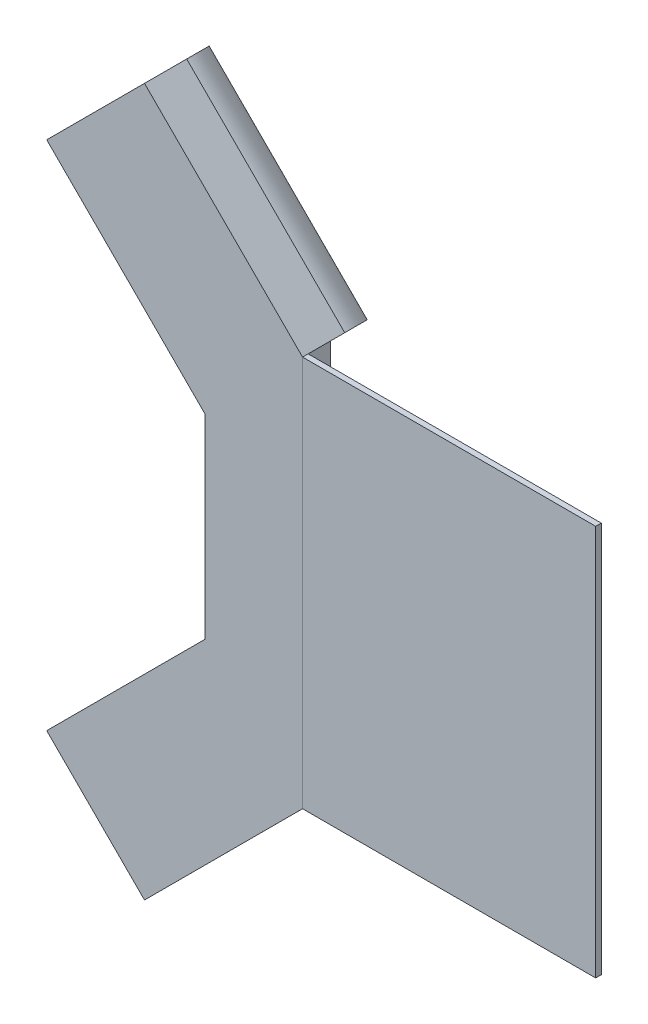
ISO-10303-21;
HEADER;
FILE_DESCRIPTION(('STEP AP214'),'2;1');
FILE_NAME('part.step','',(''),(''),'','','');
FILE_SCHEMA(('AUTOMOTIVE_DESIGN { 1 0 10303 214 1 1 1 1 }'));
ENDSEC;
DATA;
#1=APPLICATION_CONTEXT('core data for automotive mechanical design processes');
#2=APPLICATION_PROTOCOL_DEFINITION('international standard','automotive_design',2000,#1);
#3=PRODUCT_CONTEXT('',#1,'mechanical');
#4=PRODUCT('Part','Part','',(#3));
#5=PRODUCT_RELATED_PRODUCT_CATEGORY('part','',(#4));
#6=PRODUCT_DEFINITION_FORMATION('','',#4);
#7=PRODUCT_DEFINITION_CONTEXT('part definition',#1,'design');
#8=PRODUCT_DEFINITION('design','',#6,#7);
#9=PRODUCT_DEFINITION_SHAPE('','',#8);
#10=(LENGTH_UNIT() NAMED_UNIT(*) SI_UNIT(.MILLI.,.METRE.));
#11=(NAMED_UNIT(*) PLANE_ANGLE_UNIT() SI_UNIT($,.RADIAN.));
#12=(NAMED_UNIT(*) SI_UNIT($,.STERADIAN.) SOLID_ANGLE_UNIT());
#13=UNCERTAINTY_MEASURE_WITH_UNIT(LENGTH_MEASURE(1.E-05),#10,'distance_accuracy_value','');
#14=(GEOMETRIC_REPRESENTATION_CONTEXT(3) GLOBAL_UNCERTAINTY_ASSIGNED_CONTEXT((#13)) GLOBAL_UNIT_ASSIGNED_CONTEXT((#10,
#11,#12)) REPRESENTATION_CONTEXT('',''));
#15=CARTESIAN_POINT('',(0.,0.,0.));
#16=DIRECTION('',(0.,0.,1.));
#17=DIRECTION('',(1.,0.,0.));
#18=AXIS2_PLACEMENT_3D('',#15,#16,#17);
#19=CARTESIAN_POINT('',(-4.99999999999999,-15.,6.));
#20=DIRECTION('',(0.,1.,0.));
#21=DIRECTION('',(0.,0.,1.));
#22=AXIS2_PLACEMENT_3D('',#19,#20,#21);
#23=PLANE('',#22);
#24=DIRECTION('',(1.,0.,0.));
#25=VECTOR('',#24,1.);
#26=CARTESIAN_POINT('',(-4.99999999999999,-15.,5.));
#27=LINE('',#26,#25);
#28=CARTESIAN_POINT('',(-4.99758135395844,-15.0003190203177,5.));
#29=VERTEX_POINT('',#28);
#30=CARTESIAN_POINT('',(47.46,-15.,5.));
#31=VERTEX_POINT('',#30);
#32=EDGE_CURVE('E114',#29,#31,#27,.T.);
#33=ORIENTED_EDGE('',*,*,#32,.T.);
#34=DIRECTION('',(0.,0.,-1.));
#35=VECTOR('',#34,1.);
#36=CARTESIAN_POINT('',(47.46,-15.,6.));
#37=LINE('',#36,#35);
#38=CARTESIAN_POINT('',(47.46,-15.,6.));
#39=VERTEX_POINT('',#38);
#40=EDGE_CURVE('E48',#39,#31,#37,.T.);
#41=ORIENTED_EDGE('',*,*,#40,.F.);
#42=DIRECTION('',(1.,0.,0.));
#43=VECTOR('',#42,1.);
#44=CARTESIAN_POINT('',(-4.99999999999999,-15.,6.));
#45=LINE('',#44,#43);
#46=CARTESIAN_POINT('',(-4.99758135395844,-15.0003190203177,6.00095447232469));
#47=VERTEX_POINT('',#46);
#48=EDGE_CURVE('E99',#47,#39,#45,.T.);
#49=ORIENTED_EDGE('',*,*,#48,.F.);
#50=DIRECTION('',(0.,0.,-1.));
#51=VECTOR('',#50,1.);
#52=CARTESIAN_POINT('',(-4.99452466728144,-15.,6.));
#53=LINE('',#52,#51);
#54=EDGE_CURVE('E11',#47,#29,#53,.T.);
#55=ORIENTED_EDGE('',*,*,#54,.T.);
#56=EDGE_LOOP('',(#33,#41,#49,#55));
#57=FACE_BOUND('',#56,.T.);
#58=ADVANCED_FACE('F39',(#57),#23,.F.);
#59=CARTESIAN_POINT('',(47.46,55.,6.));
#60=DIRECTION('',(-1.,0.,0.));
#61=DIRECTION('',(0.,-1.,0.));
#62=AXIS2_PLACEMENT_3D('',#59,#60,#61);
#63=PLANE('',#62);
#64=DIRECTION('',(0.,1.,0.));
#65=VECTOR('',#64,1.);
#66=CARTESIAN_POINT('',(47.46,55.,5.));
#67=LINE('',#66,#65);
#68=CARTESIAN_POINT('',(47.46,55.,5.));
#69=VERTEX_POINT('',#68);
#70=EDGE_CURVE('E128',#31,#69,#67,.T.);
#71=ORIENTED_EDGE('',*,*,#70,.T.);
#72=DIRECTION('',(0.,0.,-1.));
#73=VECTOR('',#72,1.);
#74=CARTESIAN_POINT('',(47.46,55.,6.));
#75=LINE('',#74,#73);
#76=CARTESIAN_POINT('',(47.46,55.,6.));
#77=VERTEX_POINT('',#76);
#78=EDGE_CURVE('E117',#77,#69,#75,.T.);
#79=ORIENTED_EDGE('',*,*,#78,.F.);
#80=DIRECTION('',(0.,1.,0.));
#81=VECTOR('',#80,1.);
#82=CARTESIAN_POINT('',(47.46,55.,6.));
#83=LINE('',#82,#81);
#84=EDGE_CURVE('E103',#39,#77,#83,.T.);
#85=ORIENTED_EDGE('',*,*,#84,.F.);
#86=ORIENTED_EDGE('',*,*,#40,.T.);
#87=EDGE_LOOP('',(#71,#79,#85,#86));
#88=FACE_BOUND('',#87,.T.);
#89=ADVANCED_FACE('F119',(#88),#63,.F.);
#90=CARTESIAN_POINT('',(-5.,55.,6.));
#91=DIRECTION('',(0.,-1.,0.));
#92=DIRECTION('',(0.,0.,-1.));
#93=AXIS2_PLACEMENT_3D('',#90,#91,#92);
#94=PLANE('',#93);
#95=DIRECTION('',(-1.,0.,0.));
#96=VECTOR('',#95,1.);
#97=CARTESIAN_POINT('',(-5.,55.,5.));
#98=LINE('',#97,#96);
#99=CARTESIAN_POINT('',(-4.99758135395833,54.9996809796823,5.));
#100=VERTEX_POINT('',#99);
#101=EDGE_CURVE('E110',#69,#100,#98,.T.);
#102=ORIENTED_EDGE('',*,*,#101,.T.);
#103=DIRECTION('',(0.,0.,-1.));
#104=VECTOR('',#103,1.);
#105=CARTESIAN_POINT('',(-4.99580074855207,55.,6.));
#106=LINE('',#105,#104);
#107=CARTESIAN_POINT('',(-4.99758135395834,54.9996809796823,6.00095447232469));
#108=VERTEX_POINT('',#107);
#109=EDGE_CURVE('E122',#108,#100,#106,.T.);
#110=ORIENTED_EDGE('',*,*,#109,.F.);
#111=DIRECTION('',(-1.,0.,0.));
#112=VECTOR('',#111,1.);
#113=CARTESIAN_POINT('',(-5.,55.,6.));
#114=LINE('',#113,#112);
#115=EDGE_CURVE('E57',#77,#108,#114,.T.);
#116=ORIENTED_EDGE('',*,*,#115,.F.);
#117=ORIENTED_EDGE('',*,*,#78,.T.);
#118=EDGE_LOOP('',(#102,#110,#116,#117));
#119=FACE_BOUND('',#118,.T.);
#120=ADVANCED_FACE('F154',(#119),#94,.F.);
#121=CARTESIAN_POINT('',(0.,0.,6.));
#122=DIRECTION('',(0.,0.,1.));
#123=DIRECTION('',(1.,0.,0.));
#124=AXIS2_PLACEMENT_3D('',#121,#122,#123);
#125=PLANE('',#124);
#126=CARTESIAN_POINT('',(-5.,55.,6.));
#127=DIRECTION('',(0.,-1.,0.));
#128=VECTOR('',#127,1.);
#129=LINE('',#126,#128);
#130=EDGE_CURVE('E106',#108,#47,#129,.T.);
#131=ORIENTED_EDGE('',*,*,#130,.T.);
#132=ORIENTED_EDGE('',*,*,#48,.T.);
#133=ORIENTED_EDGE('',*,*,#84,.T.);
#134=ORIENTED_EDGE('',*,*,#115,.T.);
#135=EDGE_LOOP('',(#131,#132,#133,#134));
#136=FACE_BOUND('',#135,.T.);
#137=ADVANCED_FACE('F101',(#136),#125,.T.);
#138=CARTESIAN_POINT('',(0.,0.,5.));
#139=DIRECTION('',(0.,0.,1.));
#140=DIRECTION('',(1.,0.,0.));
#141=AXIS2_PLACEMENT_3D('',#138,#139,#140);
#142=PLANE('',#141);
#143=DIRECTION('',(0.,1.,0.));
#144=VECTOR('',#143,1.);
#145=CARTESIAN_POINT('',(-4.99516270791665,54.9993619593646,5.));
#146=LINE('',#145,#144);
#147=EDGE_CURVE('E135',#100,#29,#146,.F.);
#148=ORIENTED_EDGE('',*,*,#147,.F.);
#149=ORIENTED_EDGE('',*,*,#101,.F.);
#150=ORIENTED_EDGE('',*,*,#70,.F.);
#151=ORIENTED_EDGE('',*,*,#32,.F.);
#152=EDGE_LOOP('',(#148,#149,#150,#151));
#153=FACE_BOUND('',#152,.T.);
#154=ADVANCED_FACE('F153',(#153),#142,.F.);
#155=CARTESIAN_POINT('',(-4.99516270791666,54.9993619593646,1.00190894464938));
#156=DIRECTION('',(-1.,0.,0.));
#157=DIRECTION('',(0.,1.,0.));
#158=AXIS2_PLACEMENT_3D('',#155,#156,#157);
#159=PLANE('',#158);
#160=DIRECTION('',(0.,0.,-1.));
#161=VECTOR('',#160,1.);
#162=CARTESIAN_POINT('',(-4.99516270791666,54.9993619593646,1.00190894464938));
#163=LINE('',#162,#161);
#164=CARTESIAN_POINT('',(-4.99516270791668,54.9993619593646,1.00190894464937));
#165=VERTEX_POINT('',#164);
#166=EDGE_CURVE('E80',#165,#100,#163,.F.);
#167=ORIENTED_EDGE('',*,*,#166,.T.);
#168=ORIENTED_EDGE('',*,*,#147,.T.);
#169=DIRECTION('',(0.,0.,-1.));
#170=VECTOR('',#169,1.);
#171=CARTESIAN_POINT('',(-4.99516270791685,-15.0006380406354,10.0019089446494));
#172=LINE('',#171,#170);
#173=CARTESIAN_POINT('',(-4.9951627079169,-15.0006380406354,1.00190894464937));
#174=VERTEX_POINT('',#173);
#175=EDGE_CURVE('E591',#174,#29,#172,.F.);
#176=ORIENTED_EDGE('',*,*,#175,.F.);
#177=DIRECTION('',(0.,-1.,0.));
#178=VECTOR('',#177,1.);
#179=CARTESIAN_POINT('',(-4.99516270791666,54.9993619593646,1.00190894464938));
#180=LINE('',#179,#178);
#181=EDGE_CURVE('E588',#165,#174,#180,.T.);
#182=ORIENTED_EDGE('',*,*,#181,.F.);
#183=EDGE_LOOP('',(#167,#168,#176,#182));
#184=FACE_BOUND('',#183,.T.);
#185=ADVANCED_FACE('F159',(#184),#159,.F.);
#186=CARTESIAN_POINT('',(-22.4951627079167,37.4993619593648,1.00190894464944));
#187=DIRECTION('',(1.,0.,0.));
#188=DIRECTION('',(0.,-1.,0.));
#189=AXIS2_PLACEMENT_3D('',#186,#187,#188);
#190=PLANE('',#189);
#191=DIRECTION('',(0.,1.,0.));
#192=VECTOR('',#191,1.);
#193=CARTESIAN_POINT('',(-22.4951627079167,37.4993619593648,6.00190894464944));
#194=LINE('',#193,#192);
#195=CARTESIAN_POINT('',(-22.4951627079168,2.49936195936478,6.00190894464944));
#196=VERTEX_POINT('',#195);
#197=CARTESIAN_POINT('',(-22.4951627079167,37.4993619593648,6.00190894464944));
#198=VERTEX_POINT('',#197);
#199=EDGE_CURVE('E577',#196,#198,#194,.T.);
#200=ORIENTED_EDGE('',*,*,#199,.T.);
#201=DIRECTION('',(0.,0.,1.));
#202=VECTOR('',#201,1.);
#203=CARTESIAN_POINT('',(-22.4951627079167,37.4993619593648,1.00190894464944));
#204=LINE('',#203,#202);
#205=CARTESIAN_POINT('',(-22.4951627079167,37.4993619593648,1.00190894464944));
#206=VERTEX_POINT('',#205);
#207=EDGE_CURVE('E580',#206,#198,#204,.T.);
#208=ORIENTED_EDGE('',*,*,#207,.F.);
#209=DIRECTION('',(0.,1.,0.));
#210=VECTOR('',#209,1.);
#211=CARTESIAN_POINT('',(-22.4951627079167,37.4993619593648,1.00190894464944));
#212=LINE('',#211,#210);
#213=CARTESIAN_POINT('',(-22.4951627079168,2.49936195936477,1.00190894464944));
#214=VERTEX_POINT('',#213);
#215=EDGE_CURVE('E573',#214,#206,#212,.T.);
#216=ORIENTED_EDGE('',*,*,#215,.F.);
#217=DIRECTION('',(0.,0.,1.));
#218=VECTOR('',#217,1.);
#219=CARTESIAN_POINT('',(-22.4951627079168,2.49936195936477,1.00190894464944));
#220=LINE('',#219,#218);
#221=EDGE_CURVE('E89',#214,#196,#220,.T.);
#222=ORIENTED_EDGE('',*,*,#221,.T.);
#223=EDGE_LOOP('',(#200,#208,#216,#222));
#224=FACE_BOUND('',#223,.T.);
#225=ADVANCED_FACE('F155',(#224),#190,.F.);
#226=CARTESIAN_POINT('',(-42.1712598203296,-59.3362776724028,1.00190894464951));
#227=DIRECTION('',(0.,0.,1.));
#228=DIRECTION('',(-1.,0.,0.));
#229=AXIS2_PLACEMENT_3D('',#226,#227,#228);
#230=PLANE('',#229);
#231=DIRECTION('',(-0.707106781186541,0.707106781186554,0.));
#232=VECTOR('',#231,1.);
#233=CARTESIAN_POINT('',(-4.99516270791691,-15.0006380406354,1.00190894464938));
#234=LINE('',#233,#232);
#235=EDGE_CURVE('E576',#174,#214,#234,.T.);
#236=ORIENTED_EDGE('',*,*,#235,.T.);
#237=ORIENTED_EDGE('',*,*,#215,.T.);
#238=DIRECTION('',(0.707106781186551,0.707106781186544,0.));
#239=VECTOR('',#238,1.);
#240=CARTESIAN_POINT('',(-4.99516270791666,54.9993619593646,1.00190894464938));
#241=LINE('',#240,#239);
#242=EDGE_CURVE('E126',#206,#165,#241,.T.);
#243=ORIENTED_EDGE('',*,*,#242,.T.);
#244=ORIENTED_EDGE('',*,*,#181,.T.);
#245=EDGE_LOOP('',(#236,#237,#243,#244));
#246=FACE_BOUND('',#245,.T.);
#247=ADVANCED_FACE('F199',(#246),#230,.F.);
#248=CARTESIAN_POINT('',(-42.1712598203295,-59.3362776724028,6.0019089446495));
#249=DIRECTION('',(0.,0.,1.));
#250=DIRECTION('',(-1.,0.,0.));
#251=AXIS2_PLACEMENT_3D('',#248,#249,#250);
#252=PLANE('',#251);
#253=ORIENTED_EDGE('',*,*,#199,.F.);
#254=DIRECTION('',(0.707106781186554,0.707106781186541,0.));
#255=VECTOR('',#254,1.);
#256=CARTESIAN_POINT('',(-50.7794339553789,-25.7849092880969,6.00190894464953));
#257=LINE('',#256,#255);
#258=CARTESIAN_POINT('',(-50.7794339553789,-25.7849092880969,6.00190894464953));
#259=VERTEX_POINT('',#258);
#260=EDGE_CURVE('E570',#259,#196,#257,.T.);
#261=ORIENTED_EDGE('',*,*,#260,.F.);
#262=DIRECTION('',(-0.707106781186541,0.707106781186554,0.));
#263=VECTOR('',#262,1.);
#264=CARTESIAN_POINT('',(-29.6996626957013,-46.8646805477748,6.00190894464946));
#265=LINE('',#264,#263);
#266=CARTESIAN_POINT('',(-33.279433955379,-43.2849092880971,6.00190894464947));
#267=VERTEX_POINT('',#266);
#268=EDGE_CURVE('E534',#267,#259,#265,.T.);
#269=ORIENTED_EDGE('',*,*,#268,.F.);
#270=DIRECTION('',(0.707106781186554,0.707106781186541,0.));
#271=VECTOR('',#270,1.);
#272=CARTESIAN_POINT('',(-33.279433955379,-43.2849092880971,6.00190894464947));
#273=LINE('',#272,#271);
#274=EDGE_CURVE('E572',#267,#47,#273,.T.);
#275=ORIENTED_EDGE('',*,*,#274,.T.);
#276=ORIENTED_EDGE('',*,*,#130,.F.);
#277=DIRECTION('',(0.707106781186544,-0.707106781186551,0.));
#278=VECTOR('',#277,1.);
#279=CARTESIAN_POINT('',(-33.2794339553784,83.2836332068267,6.00190894464947));
#280=LINE('',#279,#278);
#281=CARTESIAN_POINT('',(-33.2794339553784,83.2836332068267,6.00190894464947));
#282=VERTEX_POINT('',#281);
#283=EDGE_CURVE('E480',#282,#108,#280,.T.);
#284=ORIENTED_EDGE('',*,*,#283,.F.);
#285=DIRECTION('',(0.707106781186551,0.707106781186544,0.));
#286=VECTOR('',#285,1.);
#287=CARTESIAN_POINT('',(-109.035302327469,7.52776483473714,6.00190894464974));
#288=LINE('',#287,#286);
#289=CARTESIAN_POINT('',(-50.7794339553784,65.7836332068269,6.00190894464953));
#290=VERTEX_POINT('',#289);
#291=EDGE_CURVE('E660',#290,#282,#288,.T.);
#292=ORIENTED_EDGE('',*,*,#291,.F.);
#293=DIRECTION('',(0.707106781186544,-0.707106781186551,0.));
#294=VECTOR('',#293,1.);
#295=CARTESIAN_POINT('',(-50.7794339553784,65.7836332068269,6.00190894464953));
#296=LINE('',#295,#294);
#297=EDGE_CURVE('E488',#290,#198,#296,.T.);
#298=ORIENTED_EDGE('',*,*,#297,.T.);
#299=EDGE_LOOP('',(#253,#261,#269,#275,#276,#284,#292,#298));
#300=FACE_BOUND('',#299,.T.);
#301=ADVANCED_FACE('F207',(#300),#252,.T.);
#302=CARTESIAN_POINT('',(-33.279433955379,-43.2849092880971,10.0019089446495));
#303=DIRECTION('',(0.707106781186541,-0.707106781186554,0.));
#304=DIRECTION('',(-0.707106781186554,-0.707106781186541,0.));
#305=AXIS2_PLACEMENT_3D('',#302,#303,#304);
#306=PLANE('',#305);
#307=ORIENTED_EDGE('',*,*,#175,.T.);
#308=ORIENTED_EDGE('',*,*,#54,.F.);
#309=ORIENTED_EDGE('',*,*,#274,.F.);
#310=DIRECTION('',(0.,0.,-1.));
#311=VECTOR('',#310,1.);
#312=CARTESIAN_POINT('',(-33.279433955379,-43.2849092880971,10.0019089446495));
#313=LINE('',#312,#311);
#314=CARTESIAN_POINT('',(-33.279433955379,-43.2849092880971,-1.54809105535053));
#315=VERTEX_POINT('',#314);
#316=EDGE_CURVE('E530',#267,#315,#313,.T.);
#317=ORIENTED_EDGE('',*,*,#316,.T.);
#318=DIRECTION('',(0.707106781186554,0.707106781186541,0.));
#319=VECTOR('',#318,1.);
#320=CARTESIAN_POINT('',(-33.279433955379,-43.2849092880971,-1.54809105535053));
#321=LINE('',#320,#319);
#322=CARTESIAN_POINT('',(-4.9951627079169,-15.0006380406354,-1.54809105535063));
#323=VERTEX_POINT('',#322);
#324=EDGE_CURVE('E558',#315,#323,#321,.T.);
#325=ORIENTED_EDGE('',*,*,#324,.T.);
#326=DIRECTION('',(0.,0.,-1.));
#327=VECTOR('',#326,1.);
#328=CARTESIAN_POINT('',(-4.99516270791686,-15.0006380406354,10.0019089446494));
#329=LINE('',#328,#327);
#330=EDGE_CURVE('E549',#174,#323,#329,.T.);
#331=ORIENTED_EDGE('',*,*,#330,.F.);
#332=EDGE_LOOP('',(#307,#308,#309,#317,#325,#331));
#333=FACE_BOUND('',#332,.T.);
#334=ADVANCED_FACE('F216',(#333),#306,.T.);
#335=CARTESIAN_POINT('',(-50.7794339553789,-25.7849092880969,10.0019089446495));
#336=DIRECTION('',(0.707106781186541,-0.707106781186554,0.));
#337=DIRECTION('',(-0.707106781186554,-0.707106781186541,0.));
#338=AXIS2_PLACEMENT_3D('',#335,#336,#337);
#339=PLANE('',#338);
#340=ORIENTED_EDGE('',*,*,#221,.F.);
#341=DIRECTION('',(0.,0.,-1.));
#342=VECTOR('',#341,1.);
#343=CARTESIAN_POINT('',(-22.4951627079167,2.49936195936477,10.0019089446494));
#344=LINE('',#343,#342);
#345=CARTESIAN_POINT('',(-22.4951627079168,2.49936195936478,-1.54809105535057));
#346=VERTEX_POINT('',#345);
#347=EDGE_CURVE('E550',#214,#346,#344,.T.);
#348=ORIENTED_EDGE('',*,*,#347,.T.);
#349=DIRECTION('',(0.707106781186554,0.707106781186541,0.));
#350=VECTOR('',#349,1.);
#351=CARTESIAN_POINT('',(-50.7794339553789,-25.7849092880969,-1.54809105535047));
#352=LINE('',#351,#350);
#353=CARTESIAN_POINT('',(-50.7794339553789,-25.7849092880969,-1.54809105535047));
#354=VERTEX_POINT('',#353);
#355=EDGE_CURVE('E567',#354,#346,#352,.T.);
#356=ORIENTED_EDGE('',*,*,#355,.F.);
#357=DIRECTION('',(0.,0.,-1.));
#358=VECTOR('',#357,1.);
#359=CARTESIAN_POINT('',(-50.7794339553789,-25.7849092880969,10.0019089446495));
#360=LINE('',#359,#358);
#361=EDGE_CURVE('E537',#259,#354,#360,.T.);
#362=ORIENTED_EDGE('',*,*,#361,.F.);
#363=ORIENTED_EDGE('',*,*,#260,.T.);
#364=EDGE_LOOP('',(#340,#348,#356,#362,#363));
#365=FACE_BOUND('',#364,.T.);
#366=ADVANCED_FACE('F225',(#365),#339,.F.);
#367=CARTESIAN_POINT('',(-29.6996626957014,-46.8646805477748,-1.54809105535054));
#368=DIRECTION('',(0.,0.,-1.));
#369=DIRECTION('',(1.,0.,0.));
#370=AXIS2_PLACEMENT_3D('',#367,#368,#369);
#371=PLANE('',#370);
#372=DIRECTION('',(-0.707106781186541,0.707106781186554,0.));
#373=VECTOR('',#372,1.);
#374=CARTESIAN_POINT('',(-1.41539144823922,-18.5804093003132,-1.54809105535064));
#375=LINE('',#374,#373);
#376=CARTESIAN_POINT('',(-17.2709363344545,-2.72486441409765,-1.54809105535059));
#377=VERTEX_POINT('',#376);
#378=EDGE_CURVE('E552',#377,#346,#375,.T.);
#379=ORIENTED_EDGE('',*,*,#378,.F.);
#380=DIRECTION('',(0.707106781186554,0.707106781186541,0.));
#381=VECTOR('',#380,1.);
#382=CARTESIAN_POINT('',(-45.5552075819166,-31.0091356615593,-1.54809105535048));
#383=LINE('',#382,#381);
#384=CARTESIAN_POINT('',(-45.5552075819166,-31.0091356615593,-1.54809105535048));
#385=VERTEX_POINT('',#384);
#386=EDGE_CURVE('E564',#385,#377,#383,.T.);
#387=ORIENTED_EDGE('',*,*,#386,.F.);
#388=DIRECTION('',(-0.707106781186541,0.707106781186554,0.));
#389=VECTOR('',#388,1.);
#390=CARTESIAN_POINT('',(-29.6996626957014,-46.8646805477748,-1.54809105535054));
#391=LINE('',#390,#389);
#392=EDGE_CURVE('E540',#385,#354,#391,.T.);
#393=ORIENTED_EDGE('',*,*,#392,.T.);
#394=ORIENTED_EDGE('',*,*,#355,.T.);
#395=EDGE_LOOP('',(#379,#387,#393,#394));
#396=FACE_BOUND('',#395,.T.);
#397=ADVANCED_FACE('F234',(#396),#371,.T.);
#398=CARTESIAN_POINT('',(-40.8066367442857,-35.7577064991903,-3.98434105535075));
#399=DIRECTION('',(0.707106781186554,0.707106781186541,0.));
#400=DIRECTION('',(0.707106781186541,-0.707106781186554,0.));
#401=AXIS2_PLACEMENT_3D('',#398,#399,#400);
#402=CYLINDRICAL_SURFACE('',#401,7.14375);
#403=CARTESIAN_POINT('',(-12.5223654968235,-7.47343525172868,-3.98434105535085));
#404=DIRECTION('',(-0.707106781186554,-0.707106781186541,0.));
#405=DIRECTION('',(-0.707106781186541,0.707106781186554,0.));
#406=AXIS2_PLACEMENT_3D('',#403,#404,#405);
#407=CIRCLE('',#406,7.14375);
#408=CARTESIAN_POINT('',(-7.77379465919257,-12.2220060893597,-1.54809105535061));
#409=VERTEX_POINT('',#408);
#410=EDGE_CURVE('E555',#377,#409,#407,.T.);
#411=ORIENTED_EDGE('',*,*,#410,.T.);
#412=DIRECTION('',(0.707106781186554,0.707106781186541,0.));
#413=VECTOR('',#412,1.);
#414=CARTESIAN_POINT('',(-36.0580659066547,-40.5062773368214,-1.54809105535052));
#415=LINE('',#414,#413);
#416=CARTESIAN_POINT('',(-36.0580659066547,-40.5062773368214,-1.54809105535052));
#417=VERTEX_POINT('',#416);
#418=EDGE_CURVE('E561',#417,#409,#415,.T.);
#419=ORIENTED_EDGE('',*,*,#418,.F.);
#420=CARTESIAN_POINT('',(-40.8066367442857,-35.7577064991903,-3.98434105535075));
#421=DIRECTION('',(-0.707106781186554,-0.707106781186541,0.));
#422=DIRECTION('',(-0.707106781186541,0.707106781186554,0.));
#423=AXIS2_PLACEMENT_3D('',#420,#421,#422);
#424=CIRCLE('',#423,7.14375);
#425=EDGE_CURVE('E543',#385,#417,#424,.T.);
#426=ORIENTED_EDGE('',*,*,#425,.F.);
#427=ORIENTED_EDGE('',*,*,#386,.T.);
#428=EDGE_LOOP('',(#411,#419,#426,#427));
#429=FACE_BOUND('',#428,.T.);
#430=ADVANCED_FACE('F242',(#429),#402,.T.);
#431=CARTESIAN_POINT('',(-40.8066367442857,-35.7577064991903,-3.98434105535075));
#432=DIRECTION('',(0.707106781186554,0.707106781186541,0.));
#433=DIRECTION('',(0.707106781186541,-0.707106781186554,0.));
#434=AXIS2_PLACEMENT_3D('',#431,#432,#433);
#435=CYLINDRICAL_SURFACE('',#434,2.43625000000026);
#436=CARTESIAN_POINT('',(-40.8066367442857,-35.7577064991903,-3.98434105535075));
#437=DIRECTION('',(-0.707106781186554,-0.707106781186541,0.));
#438=DIRECTION('',(-0.707106781186541,0.707106781186554,0.));
#439=AXIS2_PLACEMENT_3D('',#436,#437,#438);
#440=CIRCLE('',#439,2.43625000000026);
#441=CARTESIAN_POINT('',(-42.5293256399516,-34.0350176035244,-3.98434105535075));
#442=VERTEX_POINT('',#441);
#443=EDGE_CURVE('E527',#442,#442,#440,.T.);
#444=ORIENTED_EDGE('',*,*,#443,.T.);
#445=EDGE_LOOP('',(#444));
#446=FACE_BOUND('',#445,.T.);
#447=CARTESIAN_POINT('',(-12.5223654968235,-7.47343525172868,-3.98434105535085));
#448=DIRECTION('',(-0.707106781186554,-0.707106781186541,0.));
#449=DIRECTION('',(-0.707106781186541,0.707106781186554,0.));
#450=AXIS2_PLACEMENT_3D('',#447,#448,#449);
#451=CIRCLE('',#450,2.43625000000026);
#452=CARTESIAN_POINT('',(-14.2450543924894,-5.75074635606276,-3.98434105535085));
#453=VERTEX_POINT('',#452);
#454=EDGE_CURVE('E526',#453,#453,#451,.T.);
#455=ORIENTED_EDGE('',*,*,#454,.F.);
#456=EDGE_LOOP('',(#455));
#457=FACE_BOUND('',#456,.T.);
#458=ADVANCED_FACE('F252',(#446,#457),#435,.F.);
#459=EDGE_CURVE('E531',#323,#409,#375,.T.);
#460=ORIENTED_EDGE('',*,*,#459,.F.);
#461=ORIENTED_EDGE('',*,*,#324,.F.);
#462=EDGE_CURVE('E544',#315,#417,#391,.T.);
#463=ORIENTED_EDGE('',*,*,#462,.T.);
#464=ORIENTED_EDGE('',*,*,#418,.T.);
#465=EDGE_LOOP('',(#460,#461,#463,#464));
#466=FACE_BOUND('',#465,.T.);
#467=ADVANCED_FACE('F245',(#466),#371,.T.);
#468=CARTESIAN_POINT('',(-29.6996626957013,-46.8646805477748,10.0019089446495));
#469=DIRECTION('',(-0.707106781186554,-0.707106781186541,0.));
#470=DIRECTION('',(-0.707106781186541,0.707106781186554,0.));
#471=AXIS2_PLACEMENT_3D('',#468,#469,#470);
#472=PLANE('',#471);
#473=ORIENTED_EDGE('',*,*,#443,.F.);
#474=EDGE_LOOP('',(#473));
#475=FACE_BOUND('',#474,.T.);
#476=ORIENTED_EDGE('',*,*,#316,.F.);
#477=ORIENTED_EDGE('',*,*,#268,.T.);
#478=ORIENTED_EDGE('',*,*,#361,.T.);
#479=ORIENTED_EDGE('',*,*,#392,.F.);
#480=ORIENTED_EDGE('',*,*,#425,.T.);
#481=ORIENTED_EDGE('',*,*,#462,.F.);
#482=EDGE_LOOP('',(#476,#477,#478,#479,#480,#481));
#483=FACE_BOUND('',#482,.T.);
#484=ADVANCED_FACE('F269',(#475,#483),#472,.T.);
#485=CARTESIAN_POINT('',(-1.41539144823918,-18.5804093003132,10.0019089446494));
#486=DIRECTION('',(-0.707106781186554,-0.707106781186541,0.));
#487=DIRECTION('',(-0.707106781186541,0.707106781186554,0.));
#488=AXIS2_PLACEMENT_3D('',#485,#486,#487);
#489=PLANE('',#488);
#490=ORIENTED_EDGE('',*,*,#235,.F.);
#491=ORIENTED_EDGE('',*,*,#330,.T.);
#492=ORIENTED_EDGE('',*,*,#459,.T.);
#493=ORIENTED_EDGE('',*,*,#410,.F.);
#494=ORIENTED_EDGE('',*,*,#378,.T.);
#495=ORIENTED_EDGE('',*,*,#347,.F.);
#496=EDGE_LOOP('',(#490,#491,#492,#493,#494,#495));
#497=FACE_BOUND('',#496,.T.);
#498=ORIENTED_EDGE('',*,*,#454,.T.);
#499=EDGE_LOOP('',(#498));
#500=FACE_BOUND('',#499,.T.);
#501=ADVANCED_FACE('F277',(#497,#500),#489,.F.);
#502=CARTESIAN_POINT('',(-50.7794339553784,65.7836332068269,10.0019089446495));
#503=DIRECTION('',(-0.707106781186551,-0.707106781186544,0.));
#504=DIRECTION('',(-0.707106781186544,0.707106781186551,0.));
#505=AXIS2_PLACEMENT_3D('',#502,#503,#504);
#506=PLANE('',#505);
#507=ORIENTED_EDGE('',*,*,#207,.T.);
#508=ORIENTED_EDGE('',*,*,#297,.F.);
#509=DIRECTION('',(0.,0.,-1.));
#510=VECTOR('',#509,1.);
#511=CARTESIAN_POINT('',(-50.7794339553784,65.7836332068269,10.0019089446495));
#512=LINE('',#511,#510);
#513=CARTESIAN_POINT('',(-50.7794339553785,65.7836332068269,-1.54809105535047));
#514=VERTEX_POINT('',#513);
#515=EDGE_CURVE('E692',#290,#514,#512,.T.);
#516=ORIENTED_EDGE('',*,*,#515,.T.);
#517=DIRECTION('',(0.707106781186544,-0.707106781186551,0.));
#518=VECTOR('',#517,1.);
#519=CARTESIAN_POINT('',(-50.7794339553785,65.7836332068269,-1.54809105535047));
#520=LINE('',#519,#518);
#521=CARTESIAN_POINT('',(-22.4951627079167,37.4993619593648,-1.54809105535057));
#522=VERTEX_POINT('',#521);
#523=EDGE_CURVE('E514',#514,#522,#520,.T.);
#524=ORIENTED_EDGE('',*,*,#523,.T.);
#525=DIRECTION('',(0.,0.,-1.));
#526=VECTOR('',#525,1.);
#527=CARTESIAN_POINT('',(-22.4951627079167,37.4993619593648,10.0019089446494));
#528=LINE('',#527,#526);
#529=EDGE_CURVE('E493',#206,#522,#528,.T.);
#530=ORIENTED_EDGE('',*,*,#529,.F.);
#531=EDGE_LOOP('',(#507,#508,#516,#524,#530));
#532=FACE_BOUND('',#531,.T.);
#533=ADVANCED_FACE('F286',(#532),#506,.T.);
#534=CARTESIAN_POINT('',(-33.2794339553784,83.2836332068267,10.0019089446495));
#535=DIRECTION('',(-0.707106781186551,-0.707106781186544,0.));
#536=DIRECTION('',(-0.707106781186544,0.707106781186551,0.));
#537=AXIS2_PLACEMENT_3D('',#534,#535,#536);
#538=PLANE('',#537);
#539=ORIENTED_EDGE('',*,*,#166,.F.);
#540=DIRECTION('',(0.,0.,-1.));
#541=VECTOR('',#540,1.);
#542=CARTESIAN_POINT('',(-4.99516270791669,54.9993619593646,10.0019089446494));
#543=LINE('',#542,#541);
#544=CARTESIAN_POINT('',(-4.99516270791673,54.9993619593646,-1.54809105535063));
#545=VERTEX_POINT('',#544);
#546=EDGE_CURVE('E491',#165,#545,#543,.T.);
#547=ORIENTED_EDGE('',*,*,#546,.T.);
#548=DIRECTION('',(0.707106781186544,-0.707106781186551,0.));
#549=VECTOR('',#548,1.);
#550=CARTESIAN_POINT('',(-33.2794339553785,83.2836332068267,-1.54809105535053));
#551=LINE('',#550,#549);
#552=CARTESIAN_POINT('',(-33.2794339553785,83.2836332068267,-1.54809105535053));
#553=VERTEX_POINT('',#552);
#554=EDGE_CURVE('E489',#553,#545,#551,.T.);
#555=ORIENTED_EDGE('',*,*,#554,.F.);
#556=DIRECTION('',(0.,0.,-1.));
#557=VECTOR('',#556,1.);
#558=CARTESIAN_POINT('',(-33.2794339553784,83.2836332068267,10.0019089446495));
#559=LINE('',#558,#557);
#560=EDGE_CURVE('E656',#282,#553,#559,.T.);
#561=ORIENTED_EDGE('',*,*,#560,.F.);
#562=ORIENTED_EDGE('',*,*,#283,.T.);
#563=ORIENTED_EDGE('',*,*,#109,.T.);
#564=EDGE_LOOP('',(#539,#547,#555,#561,#562,#563));
#565=FACE_BOUND('',#564,.T.);
#566=ADVANCED_FACE('F295',(#565),#538,.F.);
#567=CARTESIAN_POINT('',(-109.035302327469,7.52776483473714,-1.54809105535026));
#568=DIRECTION('',(0.,0.,-1.));
#569=DIRECTION('',(1.,0.,0.));
#570=AXIS2_PLACEMENT_3D('',#567,#568,#569);
#571=PLANE('',#570);
#572=DIRECTION('',(0.707106781186551,0.707106781186544,0.));
#573=VECTOR('',#572,1.);
#574=CARTESIAN_POINT('',(-80.751031080007,-20.7565064127249,-1.54809105535036));
#575=LINE('',#574,#573);
#576=CARTESIAN_POINT('',(-7.39795628002936,52.596568387252,-1.54809105535062));
#577=VERTEX_POINT('',#576);
#578=EDGE_CURVE('E492',#577,#545,#575,.T.);
#579=ORIENTED_EDGE('',*,*,#578,.F.);
#580=DIRECTION('',(0.707106781186544,-0.707106781186551,0.));
#581=VECTOR('',#580,1.);
#582=CARTESIAN_POINT('',(-35.6822275274911,80.8808396347141,-1.54809105535052));
#583=LINE('',#582,#581);
#584=CARTESIAN_POINT('',(-35.6822275274911,80.8808396347141,-1.54809105535052));
#585=VERTEX_POINT('',#584);
#586=EDGE_CURVE('E520',#585,#577,#583,.T.);
#587=ORIENTED_EDGE('',*,*,#586,.F.);
#588=DIRECTION('',(0.707106781186551,0.707106781186544,0.));
#589=VECTOR('',#588,1.);
#590=CARTESIAN_POINT('',(-109.035302327469,7.52776483473714,-1.54809105535026));
#591=LINE('',#590,#589);
#592=EDGE_CURVE('E700',#585,#553,#591,.T.);
#593=ORIENTED_EDGE('',*,*,#592,.T.);
#594=ORIENTED_EDGE('',*,*,#554,.T.);
#595=EDGE_LOOP('',(#579,#587,#593,#594));
#596=FACE_BOUND('',#595,.T.);
#597=ADVANCED_FACE('F304',(#596),#571,.T.);
#598=CARTESIAN_POINT('',(-40.4307983651222,76.132268797083,-3.98434105535031));
#599=DIRECTION('',(0.707106781186544,-0.707106781186551,0.));
#600=DIRECTION('',(-0.707106781186551,-0.707106781186544,0.));
#601=AXIS2_PLACEMENT_3D('',#598,#599,#600);
#602=CYLINDRICAL_SURFACE('',#601,7.14375);
#603=CARTESIAN_POINT('',(-12.1465271176605,47.8479975496209,-3.98434105535041));
#604=DIRECTION('',(-0.707106781186544,0.707106781186551,0.));
#605=DIRECTION('',(0.707106781186551,0.707106781186544,0.));
#606=AXIS2_PLACEMENT_3D('',#603,#604,#605);
#607=CIRCLE('',#606,7.14375);
#608=CARTESIAN_POINT('',(-16.8950979552916,43.0994267119899,-1.54809105535059));
#609=VERTEX_POINT('',#608);
#610=EDGE_CURVE('E498',#577,#609,#607,.T.);
#611=ORIENTED_EDGE('',*,*,#610,.T.);
#612=DIRECTION('',(0.707106781186544,-0.707106781186551,0.));
#613=VECTOR('',#612,1.);
#614=CARTESIAN_POINT('',(-45.1793692027533,71.3836979594519,-1.54809105535049));
#615=LINE('',#614,#613);
#616=CARTESIAN_POINT('',(-45.1793692027533,71.3836979594519,-1.54809105535049));
#617=VERTEX_POINT('',#616);
#618=EDGE_CURVE('E516',#617,#609,#615,.T.);
#619=ORIENTED_EDGE('',*,*,#618,.F.);
#620=CARTESIAN_POINT('',(-40.4307983651222,76.132268797083,-3.98434105535031));
#621=DIRECTION('',(-0.707106781186544,0.707106781186551,0.));
#622=DIRECTION('',(0.707106781186551,0.707106781186544,0.));
#623=AXIS2_PLACEMENT_3D('',#620,#621,#622);
#624=CIRCLE('',#623,7.14375);
#625=EDGE_CURVE('E702',#585,#617,#624,.T.);
#626=ORIENTED_EDGE('',*,*,#625,.F.);
#627=ORIENTED_EDGE('',*,*,#586,.T.);
#628=EDGE_LOOP('',(#611,#619,#626,#627));
#629=FACE_BOUND('',#628,.T.);
#630=ADVANCED_FACE('F312',(#629),#602,.T.);
#631=CARTESIAN_POINT('',(-40.4307983651222,76.132268797083,-3.98434105535031));
#632=DIRECTION('',(0.707106781186544,-0.707106781186551,0.));
#633=DIRECTION('',(-0.707106781186551,-0.707106781186544,0.));
#634=AXIS2_PLACEMENT_3D('',#631,#632,#633);
#635=CYLINDRICAL_SURFACE('',#634,2.43624999999982);
#636=CARTESIAN_POINT('',(-40.4307983651222,76.132268797083,-3.98434105535031));
#637=DIRECTION('',(-0.707106781186544,0.707106781186551,0.));
#638=DIRECTION('',(0.707106781186551,0.707106781186544,0.));
#639=AXIS2_PLACEMENT_3D('',#636,#637,#638);
#640=CIRCLE('',#639,2.43624999999982);
#641=CARTESIAN_POINT('',(-38.7081094694566,77.8549576927486,-3.98434105535032));
#642=VERTEX_POINT('',#641);
#643=EDGE_CURVE('E690',#642,#642,#640,.T.);
#644=ORIENTED_EDGE('',*,*,#643,.T.);
#645=EDGE_LOOP('',(#644));
#646=FACE_BOUND('',#645,.T.);
#647=CARTESIAN_POINT('',(-12.1465271176605,47.8479975496209,-3.98434105535041));
#648=DIRECTION('',(-0.707106781186544,0.707106781186551,0.));
#649=DIRECTION('',(0.707106781186551,0.707106781186544,0.));
#650=AXIS2_PLACEMENT_3D('',#647,#648,#649);
#651=CIRCLE('',#650,2.43624999999982);
#652=CARTESIAN_POINT('',(-10.4238382219949,49.5706864452865,-3.98434105535042));
#653=VERTEX_POINT('',#652);
#654=EDGE_CURVE('E502',#653,#653,#651,.T.);
#655=ORIENTED_EDGE('',*,*,#654,.F.);
#656=EDGE_LOOP('',(#655));
#657=FACE_BOUND('',#656,.T.);
#658=ADVANCED_FACE('F322',(#646,#657),#635,.F.);
#659=EDGE_CURVE('E500',#522,#609,#575,.T.);
#660=ORIENTED_EDGE('',*,*,#659,.F.);
#661=ORIENTED_EDGE('',*,*,#523,.F.);
#662=EDGE_CURVE('E517',#514,#617,#591,.T.);
#663=ORIENTED_EDGE('',*,*,#662,.T.);
#664=ORIENTED_EDGE('',*,*,#618,.T.);
#665=EDGE_LOOP('',(#660,#661,#663,#664));
#666=FACE_BOUND('',#665,.T.);
#667=ADVANCED_FACE('F315',(#666),#571,.T.);
#668=CARTESIAN_POINT('',(-109.035302327469,7.52776483473714,10.0019089446497));
#669=DIRECTION('',(-0.707106781186544,0.707106781186551,0.));
#670=DIRECTION('',(0.707106781186551,0.707106781186544,0.));
#671=AXIS2_PLACEMENT_3D('',#668,#669,#670);
#672=PLANE('',#671);
#673=ORIENTED_EDGE('',*,*,#643,.F.);
#674=EDGE_LOOP('',(#673));
#675=FACE_BOUND('',#674,.T.);
#676=ORIENTED_EDGE('',*,*,#515,.F.);
#677=ORIENTED_EDGE('',*,*,#291,.T.);
#678=ORIENTED_EDGE('',*,*,#560,.T.);
#679=ORIENTED_EDGE('',*,*,#592,.F.);
#680=ORIENTED_EDGE('',*,*,#625,.T.);
#681=ORIENTED_EDGE('',*,*,#662,.F.);
#682=EDGE_LOOP('',(#676,#677,#678,#679,#680,#681));
#683=FACE_BOUND('',#682,.T.);
#684=ADVANCED_FACE('F339',(#675,#683),#672,.T.);
#685=CARTESIAN_POINT('',(-80.751031080007,-20.7565064127249,10.0019089446496));
#686=DIRECTION('',(-0.707106781186544,0.707106781186551,0.));
#687=DIRECTION('',(0.707106781186551,0.707106781186544,0.));
#688=AXIS2_PLACEMENT_3D('',#685,#686,#687);
#689=PLANE('',#688);
#690=ORIENTED_EDGE('',*,*,#242,.F.);
#691=ORIENTED_EDGE('',*,*,#529,.T.);
#692=ORIENTED_EDGE('',*,*,#659,.T.);
#693=ORIENTED_EDGE('',*,*,#610,.F.);
#694=ORIENTED_EDGE('',*,*,#578,.T.);
#695=ORIENTED_EDGE('',*,*,#546,.F.);
#696=EDGE_LOOP('',(#690,#691,#692,#693,#694,#695));
#697=FACE_BOUND('',#696,.T.);
#698=ORIENTED_EDGE('',*,*,#654,.T.);
#699=EDGE_LOOP('',(#698));
#700=FACE_BOUND('',#699,.T.);
#701=ADVANCED_FACE('F347',(#697,#700),#689,.F.);
#702=CLOSED_SHELL('',(#58,#89,#120,#137,#154,#185,#225,#247,#301,#334,#366,#397,#430,#458,#467,
#484,#501,#533,#566,#597,#630,#658,#667,#684,#701));
#703=MANIFOLD_SOLID_BREP('B2',#702);
#704=ADVANCED_BREP_SHAPE_REPRESENTATION('',(#18,#703),#14);
#705=SHAPE_DEFINITION_REPRESENTATION(#9,#704);
ENDSEC;
END-ISO-10303-21;
